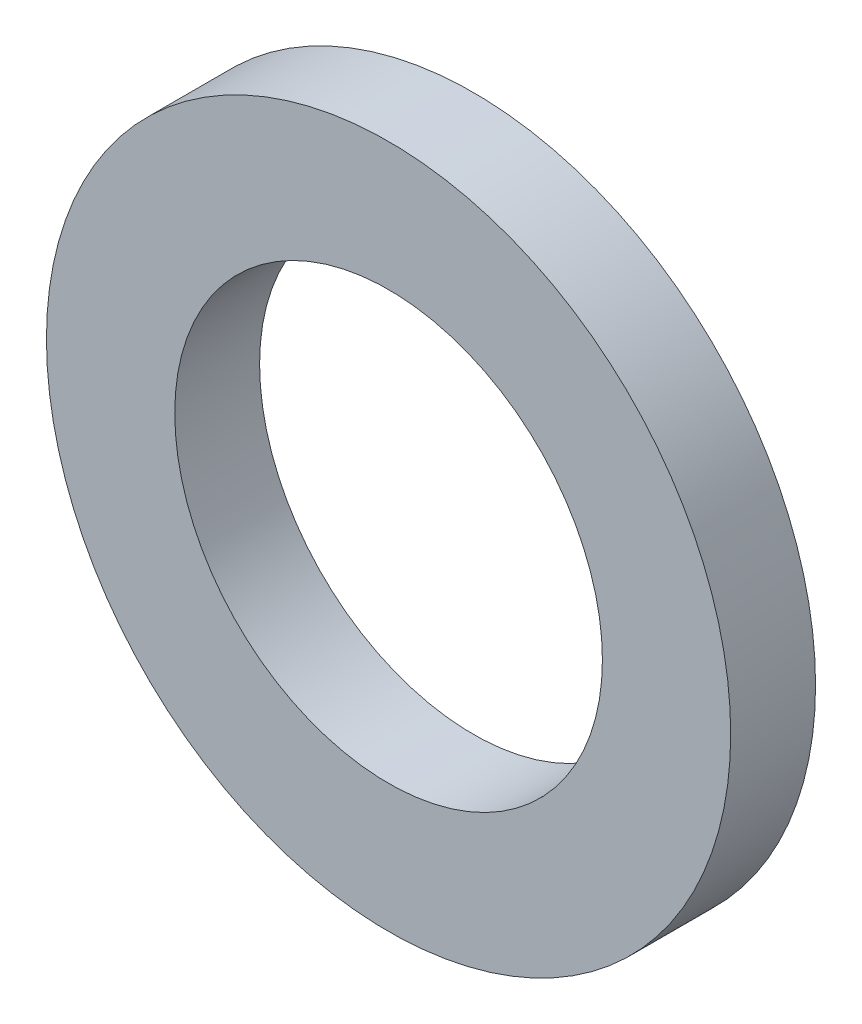
ISO-10303-21;
HEADER;
FILE_DESCRIPTION(('STEP AP214'),'2;1');
FILE_NAME('part.step','',(''),(''),'','','');
FILE_SCHEMA(('AUTOMOTIVE_DESIGN { 1 0 10303 214 1 1 1 1 }'));
ENDSEC;
DATA;
#1=APPLICATION_CONTEXT('core data for automotive mechanical design processes');
#2=APPLICATION_PROTOCOL_DEFINITION('international standard','automotive_design',2000,#1);
#3=PRODUCT_CONTEXT('',#1,'mechanical');
#4=PRODUCT('Part','Part','',(#3));
#5=PRODUCT_RELATED_PRODUCT_CATEGORY('part','',(#4));
#6=PRODUCT_DEFINITION_FORMATION('','',#4);
#7=PRODUCT_DEFINITION_CONTEXT('part definition',#1,'design');
#8=PRODUCT_DEFINITION('design','',#6,#7);
#9=PRODUCT_DEFINITION_SHAPE('','',#8);
#10=(LENGTH_UNIT() NAMED_UNIT(*) SI_UNIT(.MILLI.,.METRE.));
#11=(NAMED_UNIT(*) PLANE_ANGLE_UNIT() SI_UNIT($,.RADIAN.));
#12=(NAMED_UNIT(*) SI_UNIT($,.STERADIAN.) SOLID_ANGLE_UNIT());
#13=UNCERTAINTY_MEASURE_WITH_UNIT(LENGTH_MEASURE(1.E-05),#10,'distance_accuracy_value','');
#14=(GEOMETRIC_REPRESENTATION_CONTEXT(3) GLOBAL_UNCERTAINTY_ASSIGNED_CONTEXT((#13)) GLOBAL_UNIT_ASSIGNED_CONTEXT((#10,
#11,#12)) REPRESENTATION_CONTEXT('',''));
#15=CARTESIAN_POINT('',(0.,0.,0.));
#16=DIRECTION('',(0.,0.,1.));
#17=DIRECTION('',(1.,0.,0.));
#18=AXIS2_PLACEMENT_3D('',#15,#16,#17);
#19=CARTESIAN_POINT('',(0.,0.,1.5748));
#20=DIRECTION('',(0.,0.,1.));
#21=DIRECTION('',(1.,0.,0.));
#22=AXIS2_PLACEMENT_3D('',#19,#20,#21);
#23=PLANE('',#22);
#24=CARTESIAN_POINT('',(0.,0.,1.5748));
#25=DIRECTION('',(0.,0.,1.));
#26=DIRECTION('',(1.,0.,0.));
#27=AXIS2_PLACEMENT_3D('',#24,#25,#26);
#28=CIRCLE('',#27,6.35);
#29=CARTESIAN_POINT('',(6.35,0.,1.5748));
#30=VERTEX_POINT('',#29);
#31=EDGE_CURVE('E10',#30,#30,#28,.T.);
#32=ORIENTED_EDGE('',*,*,#31,.T.);
#33=EDGE_LOOP('',(#32));
#34=FACE_BOUND('',#33,.T.);
#35=CARTESIAN_POINT('',(0.,0.,1.5748));
#36=DIRECTION('',(0.,0.,1.));
#37=DIRECTION('',(1.,0.,0.));
#38=AXIS2_PLACEMENT_3D('',#35,#36,#37);
#39=CIRCLE('',#38,3.96875);
#40=CARTESIAN_POINT('',(3.96875,0.,1.5748));
#41=VERTEX_POINT('',#40);
#42=EDGE_CURVE('E46',#41,#41,#39,.T.);
#43=ORIENTED_EDGE('',*,*,#42,.F.);
#44=EDGE_LOOP('',(#43));
#45=FACE_BOUND('',#44,.T.);
#46=ADVANCED_FACE('F35',(#34,#45),#23,.T.);
#47=CARTESIAN_POINT('',(0.,0.,0.));
#48=DIRECTION('',(0.,0.,1.));
#49=DIRECTION('',(1.,0.,0.));
#50=AXIS2_PLACEMENT_3D('',#47,#48,#49);
#51=PLANE('',#50);
#52=CARTESIAN_POINT('',(0.,0.,0.));
#53=DIRECTION('',(0.,0.,1.));
#54=DIRECTION('',(1.,0.,0.));
#55=AXIS2_PLACEMENT_3D('',#52,#53,#54);
#56=CIRCLE('',#55,6.35);
#57=CARTESIAN_POINT('',(6.35,0.,0.));
#58=VERTEX_POINT('',#57);
#59=EDGE_CURVE('E39',#58,#58,#56,.T.);
#60=ORIENTED_EDGE('',*,*,#59,.F.);
#61=EDGE_LOOP('',(#60));
#62=FACE_BOUND('',#61,.T.);
#63=CARTESIAN_POINT('',(0.,0.,0.));
#64=DIRECTION('',(0.,0.,1.));
#65=DIRECTION('',(1.,0.,0.));
#66=AXIS2_PLACEMENT_3D('',#63,#64,#65);
#67=CIRCLE('',#66,3.96875);
#68=CARTESIAN_POINT('',(3.96875,0.,0.));
#69=VERTEX_POINT('',#68);
#70=EDGE_CURVE('E48',#69,#69,#67,.T.);
#71=ORIENTED_EDGE('',*,*,#70,.T.);
#72=EDGE_LOOP('',(#71));
#73=FACE_BOUND('',#72,.T.);
#74=ADVANCED_FACE('F58',(#62,#73),#51,.F.);
#75=CARTESIAN_POINT('',(0.,0.,1.5748));
#76=DIRECTION('',(0.,0.,-1.));
#77=DIRECTION('',(-1.,0.,0.));
#78=AXIS2_PLACEMENT_3D('',#75,#76,#77);
#79=CYLINDRICAL_SURFACE('',#78,6.35);
#80=ORIENTED_EDGE('',*,*,#31,.F.);
#81=EDGE_LOOP('',(#80));
#82=FACE_BOUND('',#81,.T.);
#83=ORIENTED_EDGE('',*,*,#59,.T.);
#84=EDGE_LOOP('',(#83));
#85=FACE_BOUND('',#84,.T.);
#86=ADVANCED_FACE('F37',(#82,#85),#79,.T.);
#87=CARTESIAN_POINT('',(0.,0.,1.5748));
#88=DIRECTION('',(0.,0.,-1.));
#89=DIRECTION('',(-1.,0.,0.));
#90=AXIS2_PLACEMENT_3D('',#87,#88,#89);
#91=CYLINDRICAL_SURFACE('',#90,3.96875);
#92=ORIENTED_EDGE('',*,*,#42,.T.);
#93=EDGE_LOOP('',(#92));
#94=FACE_BOUND('',#93,.T.);
#95=ORIENTED_EDGE('',*,*,#70,.F.);
#96=EDGE_LOOP('',(#95));
#97=FACE_BOUND('',#96,.T.);
#98=ADVANCED_FACE('F54',(#94,#97),#91,.F.);
#99=CLOSED_SHELL('',(#46,#74,#86,#98));
#100=MANIFOLD_SOLID_BREP('B2',#99);
#101=ADVANCED_BREP_SHAPE_REPRESENTATION('',(#18,#100),#14);
#102=SHAPE_DEFINITION_REPRESENTATION(#9,#101);
ENDSEC;
END-ISO-10303-21;
